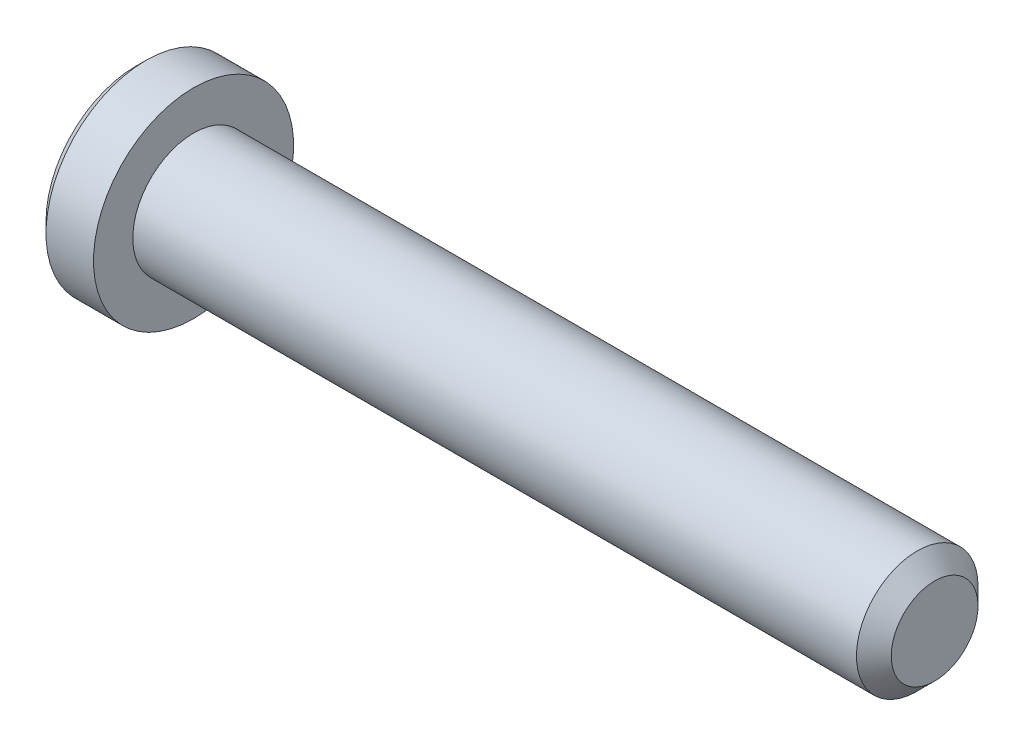
ISO-10303-21;
HEADER;
FILE_DESCRIPTION(('STEP AP214'),'2;1');
FILE_NAME('part.step','',(''),(''),'','','');
FILE_SCHEMA(('AUTOMOTIVE_DESIGN { 1 0 10303 214 1 1 1 1 }'));
ENDSEC;
DATA;
#1=APPLICATION_CONTEXT('core data for automotive mechanical design processes');
#2=APPLICATION_PROTOCOL_DEFINITION('international standard','automotive_design',2000,#1);
#3=PRODUCT_CONTEXT('',#1,'mechanical');
#4=PRODUCT('Part','Part','',(#3));
#5=PRODUCT_RELATED_PRODUCT_CATEGORY('part','',(#4));
#6=PRODUCT_DEFINITION_FORMATION('','',#4);
#7=PRODUCT_DEFINITION_CONTEXT('part definition',#1,'design');
#8=PRODUCT_DEFINITION('design','',#6,#7);
#9=PRODUCT_DEFINITION_SHAPE('','',#8);
#10=(LENGTH_UNIT() NAMED_UNIT(*) SI_UNIT(.MILLI.,.METRE.));
#11=(NAMED_UNIT(*) PLANE_ANGLE_UNIT() SI_UNIT($,.RADIAN.));
#12=(NAMED_UNIT(*) SI_UNIT($,.STERADIAN.) SOLID_ANGLE_UNIT());
#13=UNCERTAINTY_MEASURE_WITH_UNIT(LENGTH_MEASURE(1.E-05),#10,'distance_accuracy_value','');
#14=(GEOMETRIC_REPRESENTATION_CONTEXT(3) GLOBAL_UNCERTAINTY_ASSIGNED_CONTEXT((#13)) GLOBAL_UNIT_ASSIGNED_CONTEXT((#10,
#11,#12)) REPRESENTATION_CONTEXT('',''));
#15=CARTESIAN_POINT('',(0.,0.,0.));
#16=DIRECTION('',(0.,0.,1.));
#17=DIRECTION('',(1.,0.,0.));
#18=AXIS2_PLACEMENT_3D('',#15,#16,#17);
#19=CARTESIAN_POINT('',(-14.684375,3.0734,0.));
#20=DIRECTION('',(-1.,0.,0.));
#21=DIRECTION('',(0.,-1.,0.));
#22=AXIS2_PLACEMENT_3D('',#19,#20,#21);
#23=PLANE('',#22);
#24=CARTESIAN_POINT('',(-14.684375,0.,0.));
#25=DIRECTION('',(-1.,0.,0.));
#26=DIRECTION('',(0.,-1.,0.));
#27=AXIS2_PLACEMENT_3D('',#24,#25,#26);
#28=CIRCLE('',#27,1.14567944042313);
#29=CARTESIAN_POINT('',(-14.684375,-1.14567944042308,-1.38452617426399E-13));
#30=VERTEX_POINT('',#29);
#31=CARTESIAN_POINT('',(-14.684375,-0.572839720211641,0.992187499999899));
#32=VERTEX_POINT('',#31);
#33=EDGE_CURVE('E131',#30,#32,#28,.T.);
#34=ORIENTED_EDGE('',*,*,#33,.F.);
#35=CARTESIAN_POINT('',(-14.684375,-0.572839720211583,-0.9921875));
#36=VERTEX_POINT('',#35);
#37=EDGE_CURVE('E130',#36,#30,#28,.T.);
#38=ORIENTED_EDGE('',*,*,#37,.F.);
#39=CARTESIAN_POINT('',(-14.684375,0.572839720211552,-0.992187499999999));
#40=VERTEX_POINT('',#39);
#41=EDGE_CURVE('E100',#40,#36,#28,.T.);
#42=ORIENTED_EDGE('',*,*,#41,.F.);
#43=CARTESIAN_POINT('',(-14.684375,1.14567944042317,0.));
#44=VERTEX_POINT('',#43);
#45=EDGE_CURVE('E93',#44,#40,#28,.T.);
#46=ORIENTED_EDGE('',*,*,#45,.F.);
#47=CARTESIAN_POINT('',(-14.684375,0.572839720211549,0.9921875));
#48=VERTEX_POINT('',#47);
#49=EDGE_CURVE('E54',#48,#44,#28,.T.);
#50=ORIENTED_EDGE('',*,*,#49,.F.);
#51=EDGE_CURVE('E61',#32,#48,#28,.T.);
#52=ORIENTED_EDGE('',*,*,#51,.F.);
#53=EDGE_LOOP('',(#34,#38,#42,#46,#50,#52));
#54=FACE_BOUND('',#53,.T.);
#55=CARTESIAN_POINT('',(-14.684375,0.,0.));
#56=DIRECTION('',(1.,0.,0.));
#57=DIRECTION('',(0.,1.,0.));
#58=AXIS2_PLACEMENT_3D('',#55,#56,#57);
#59=CIRCLE('',#58,3.0734);
#60=CARTESIAN_POINT('',(-14.684375,3.0734,0.));
#61=VERTEX_POINT('',#60);
#62=EDGE_CURVE('E220',#61,#61,#59,.T.);
#63=ORIENTED_EDGE('',*,*,#62,.F.);
#64=EDGE_LOOP('',(#63));
#65=FACE_BOUND('',#64,.T.);
#66=ADVANCED_FACE('F34',(#54,#65),#23,.T.);
#67=CARTESIAN_POINT('',(-12.7,0.,0.));
#68=DIRECTION('',(1.,0.,0.));
#69=DIRECTION('',(0.,0.,-1.));
#70=AXIS2_PLACEMENT_3D('',#67,#68,#69);
#71=CYLINDRICAL_SURFACE('',#70,2.0828);
#72=CARTESIAN_POINT('',(12.1046875,0.,0.));
#73=DIRECTION('',(1.,0.,0.));
#74=DIRECTION('',(0.,0.,-1.));
#75=AXIS2_PLACEMENT_3D('',#72,#73,#74);
#76=CIRCLE('',#75,2.0828);
#77=CARTESIAN_POINT('',(12.1046875,0.,-2.0828));
#78=VERTEX_POINT('',#77);
#79=EDGE_CURVE('E48',#78,#78,#76,.F.);
#80=ORIENTED_EDGE('',*,*,#79,.T.);
#81=EDGE_LOOP('',(#80));
#82=FACE_BOUND('',#81,.T.);
#83=CARTESIAN_POINT('',(-12.7,0.,0.));
#84=DIRECTION('',(1.,0.,0.));
#85=DIRECTION('',(0.,1.,0.));
#86=AXIS2_PLACEMENT_3D('',#83,#84,#85);
#87=CIRCLE('',#86,2.0828);
#88=CARTESIAN_POINT('',(-12.7,2.08279999999999,0.));
#89=VERTEX_POINT('',#88);
#90=EDGE_CURVE('E213',#89,#89,#87,.F.);
#91=ORIENTED_EDGE('',*,*,#90,.F.);
#92=EDGE_LOOP('',(#91));
#93=FACE_BOUND('',#92,.T.);
#94=ADVANCED_FACE('F193',(#82,#93),#71,.T.);
#95=CARTESIAN_POINT('',(12.7,0.,0.));
#96=DIRECTION('',(1.,0.,0.));
#97=DIRECTION('',(0.,0.,-1.));
#98=AXIS2_PLACEMENT_3D('',#95,#96,#97);
#99=PLANE('',#98);
#100=CARTESIAN_POINT('',(12.7,0.,0.));
#101=DIRECTION('',(1.,0.,0.));
#102=DIRECTION('',(0.,0.,-1.));
#103=AXIS2_PLACEMENT_3D('',#100,#101,#102);
#104=CIRCLE('',#103,1.4874875);
#105=CARTESIAN_POINT('',(12.7,0.,-1.4874875));
#106=VERTEX_POINT('',#105);
#107=EDGE_CURVE('E214',#106,#106,#104,.T.);
#108=ORIENTED_EDGE('',*,*,#107,.T.);
#109=EDGE_LOOP('',(#108));
#110=FACE_BOUND('',#109,.T.);
#111=ADVANCED_FACE('F201',(#110),#99,.T.);
#112=CARTESIAN_POINT('',(12.7,0.,0.));
#113=DIRECTION('',(-1.,0.,0.));
#114=DIRECTION('',(0.,0.,1.));
#115=AXIS2_PLACEMENT_3D('',#112,#113,#114);
#116=CONICAL_SURFACE('',#115,1.4874875,0.785398163397445);
#117=ORIENTED_EDGE('',*,*,#79,.F.);
#118=EDGE_LOOP('',(#117));
#119=FACE_BOUND('',#118,.T.);
#120=ORIENTED_EDGE('',*,*,#107,.F.);
#121=EDGE_LOOP('',(#120));
#122=FACE_BOUND('',#121,.T.);
#123=ADVANCED_FACE('F36',(#119,#122),#116,.T.);
#124=CARTESIAN_POINT('',(-12.7,0.,0.));
#125=DIRECTION('',(1.,0.,0.));
#126=DIRECTION('',(0.,1.,0.));
#127=AXIS2_PLACEMENT_3D('',#124,#125,#126);
#128=CYLINDRICAL_SURFACE('',#127,3.429);
#129=CARTESIAN_POINT('',(-14.328775,0.,0.));
#130=DIRECTION('',(1.,0.,0.));
#131=DIRECTION('',(0.,1.,0.));
#132=AXIS2_PLACEMENT_3D('',#129,#130,#131);
#133=CIRCLE('',#132,3.429);
#134=CARTESIAN_POINT('',(-14.328775,3.429,0.));
#135=VERTEX_POINT('',#134);
#136=EDGE_CURVE('E215',#135,#135,#133,.T.);
#137=ORIENTED_EDGE('',*,*,#136,.T.);
#138=EDGE_LOOP('',(#137));
#139=FACE_BOUND('',#138,.T.);
#140=CARTESIAN_POINT('',(-12.7,0.,0.));
#141=DIRECTION('',(1.,0.,0.));
#142=DIRECTION('',(0.,1.,0.));
#143=AXIS2_PLACEMENT_3D('',#140,#141,#142);
#144=CIRCLE('',#143,3.429);
#145=CARTESIAN_POINT('',(-12.7,3.429,0.));
#146=VERTEX_POINT('',#145);
#147=EDGE_CURVE('E225',#146,#146,#144,.T.);
#148=ORIENTED_EDGE('',*,*,#147,.F.);
#149=EDGE_LOOP('',(#148));
#150=FACE_BOUND('',#149,.T.);
#151=ADVANCED_FACE('F196',(#139,#150),#128,.T.);
#152=CARTESIAN_POINT('',(-14.328775,0.,0.));
#153=DIRECTION('',(1.,0.,0.));
#154=DIRECTION('',(0.,1.,0.));
#155=AXIS2_PLACEMENT_3D('',#152,#153,#154);
#156=CONICAL_SURFACE('',#155,3.429,0.785398163397454);
#157=ORIENTED_EDGE('',*,*,#62,.T.);
#158=EDGE_LOOP('',(#157));
#159=FACE_BOUND('',#158,.T.);
#160=ORIENTED_EDGE('',*,*,#136,.F.);
#161=EDGE_LOOP('',(#160));
#162=FACE_BOUND('',#161,.T.);
#163=ADVANCED_FACE('F189',(#159,#162),#156,.T.);
#164=CARTESIAN_POINT('',(-12.7,3.429,0.));
#165=DIRECTION('',(1.,0.,0.));
#166=DIRECTION('',(0.,1.,0.));
#167=AXIS2_PLACEMENT_3D('',#164,#165,#166);
#168=PLANE('',#167);
#169=ORIENTED_EDGE('',*,*,#90,.T.);
#170=EDGE_LOOP('',(#169));
#171=FACE_BOUND('',#170,.T.);
#172=ORIENTED_EDGE('',*,*,#147,.T.);
#173=EDGE_LOOP('',(#172));
#174=FACE_BOUND('',#173,.T.);
#175=ADVANCED_FACE('F153',(#171,#174),#168,.T.);
#176=CARTESIAN_POINT('',(-14.684375,0.,0.));
#177=DIRECTION('',(-1.,0.,0.));
#178=DIRECTION('',(0.,-1.,0.));
#179=AXIS2_PLACEMENT_3D('',#176,#177,#178);
#180=CONICAL_SURFACE('',#179,1.14567944042313,0.78539816339745);
#181=CARTESIAN_POINT('',(-15.0518670395339,-1.14247621095534,-0.9921875));
#182=CARTESIAN_POINT('',(-15.0308666393704,-1.11465764817298,-0.9921875));
#183=CARTESIAN_POINT('',(-15.0100721478217,-1.0866840810974,-0.9921875));
#184=CARTESIAN_POINT('',(-14.9689800377932,-1.03036405380653,-0.9921875));
#185=CARTESIAN_POINT('',(-14.9486825444586,-1.00201750238009,-0.9921875));
#186=CARTESIAN_POINT('',(-14.8883735075809,-0.915909012474786,-0.9921875));
#187=CARTESIAN_POINT('',(-14.84926885225,-0.857501195957519,-0.9921875));
#188=CARTESIAN_POINT('',(-14.7725017528187,-0.735022281337401,-0.9921875));
#189=CARTESIAN_POINT('',(-14.7350490310438,-0.670818221979864,-0.9921875));
#190=CARTESIAN_POINT('',(-14.6665400204898,-0.539203244273782,-0.9921875));
#191=CARTESIAN_POINT('',(-14.6354621682745,-0.471804119013381,-0.9921875));
#192=CARTESIAN_POINT('',(-14.59744129625,-0.370637445291591,-0.9921875));
#193=CARTESIAN_POINT('',(-14.5865290323464,-0.338367677294384,-0.9921875));
#194=CARTESIAN_POINT('',(-14.567295230113,-0.273049086298082,-0.9921875));
#195=CARTESIAN_POINT('',(-14.5589738702603,-0.240000209797889,-0.992187499999999));
#196=CARTESIAN_POINT('',(-14.5454937736932,-0.173878395879195,-0.992187499999999));
#197=CARTESIAN_POINT('',(-14.5402803939747,-0.140816774783549,-0.992187499999999));
#198=CARTESIAN_POINT('',(-14.5331147124628,-0.0743291672741193,-0.992187499999999));
#199=CARTESIAN_POINT('',(-14.5311629080388,-0.0409031260707102,-0.992187499999999));
#200=CARTESIAN_POINT('',(-14.5306684859037,0.0247631140270745,-0.992187499999999));
#201=CARTESIAN_POINT('',(-14.5320050314158,0.0570024444112557,-0.992187499999999));
#202=CARTESIAN_POINT('',(-14.5377460432024,0.121194220405765,-0.992187499999999));
#203=CARTESIAN_POINT('',(-14.542149804079,0.153146730268024,-0.992187499999999));
#204=CARTESIAN_POINT('',(-14.5538595111375,0.217090524553705,-0.992187499999999));
#205=CARTESIAN_POINT('',(-14.5612153024107,0.249072542042784,-0.992187499999999));
#206=CARTESIAN_POINT('',(-14.5784380913517,0.312337779646092,-0.992187499999999));
#207=CARTESIAN_POINT('',(-14.5883048788974,0.343621057993227,-0.992187499999999));
#208=CARTESIAN_POINT('',(-14.623081111541,0.442112982998661,-0.992187499999999));
#209=CARTESIAN_POINT('',(-14.651951164078,0.507919771037783,-0.992187499999999));
#210=CARTESIAN_POINT('',(-14.7161402098149,0.636441890981787,-0.992187499999999));
#211=CARTESIAN_POINT('',(-14.7514823720824,0.699145053739879,-0.992187499999999));
#212=CARTESIAN_POINT('',(-14.8243963707045,0.818979829838917,-0.992187499999999));
#213=CARTESIAN_POINT('',(-14.8617701348683,0.876233471440161,-0.992187499999999));
#214=CARTESIAN_POINT('',(-14.919546111699,0.960585190489432,-0.992187499999999));
#215=CARTESIAN_POINT('',(-14.939008487457,0.988338378120982,-0.992187499999999));
#216=CARTESIAN_POINT('',(-14.978447981541,1.04346551309543,-0.992187499999999));
#217=CARTESIAN_POINT('',(-14.9984249576456,1.07083956207303,-0.992187499999999));
#218=CARTESIAN_POINT('',(-15.0186153053952,1.0980557448995,-0.992187499999999));
#219=B_SPLINE_CURVE_WITH_KNOTS('',3,(#181,#182,#183,#184,#185,#186,#187,#188,#189,#190,#191,
#192,#193,#194,#195,#196,#197,#198,#199,#200,#201,#202,#203,#204,#205,#206,#207,#208,#209,#210,
#211,#212,#213,#214,#215,#216,#217,#218),.UNSPECIFIED.,.F.,.F.,(4,2,2,2,2,2,2,2,2,2,2,2,2,2,2,2,
2,2,4),(0.,0.10456312739161,0.209152318718927,0.419927099055503,0.642732653996042,
0.864771652302228,0.966879847198801,1.06899507437093,1.16925752996555,1.26953527354785,
1.3661835169853,1.46280954060146,1.56114078104358,1.65946379575198,1.87441437169287,
2.09015003601506,2.29516517561961,2.3968530336129,2.49851308319265),.UNSPECIFIED.);
#220=EDGE_CURVE('E11',#36,#40,#219,.T.);
#221=ORIENTED_EDGE('',*,*,#220,.T.);
#222=ORIENTED_EDGE('',*,*,#41,.T.);
#223=EDGE_LOOP('',(#221,#222));
#224=FACE_BOUND('',#223,.T.);
#225=ADVANCED_FACE('F105',(#224),#180,.F.);
#226=CARTESIAN_POINT('',(-14.6844904875091,-1.145794910477,0.000200000000000311));
#227=CARTESIAN_POINT('',(-14.6648078114047,-1.12609913995856,-0.0339140752321567));
#228=CARTESIAN_POINT('',(-14.6462806845185,-1.10607402631377,-0.0685985894922816));
#229=CARTESIAN_POINT('',(-14.6123573296505,-1.06524035596263,-0.139324581199964));
#230=CARTESIAN_POINT('',(-14.596979987231,-1.04442791197037,-0.175372791624248));
#231=CARTESIAN_POINT('',(-14.5706381427344,-1.00246048249572,-0.248062511737404));
#232=CARTESIAN_POINT('',(-14.5596073965132,-0.981316196707006,-0.284685489013211));
#233=CARTESIAN_POINT('',(-14.542611205673,-0.938562244623581,-0.358737506246069));
#234=CARTESIAN_POINT('',(-14.536633067579,-0.916953885244204,-0.396164282559356));
#235=CARTESIAN_POINT('',(-14.5312413449144,-0.879714587318145,-0.460664638605487));
#236=CARTESIAN_POINT('',(-14.5304439963884,-0.864132099442432,-0.487654299314546));
#237=CARTESIAN_POINT('',(-14.5317831933615,-0.832997298779841,-0.541581355945683));
#238=CARTESIAN_POINT('',(-14.5339203861371,-0.817444993408161,-0.568518739024259));
#239=CARTESIAN_POINT('',(-14.5445925713061,-0.771010163908472,-0.64894622295852));
#240=CARTESIAN_POINT('',(-14.5573893807228,-0.740358726795432,-0.702036069363307));
#241=CARTESIAN_POINT('',(-14.5882724676502,-0.686562055130068,-0.795214637965818));
#242=CARTESIAN_POINT('',(-14.6047400089078,-0.663164549602735,-0.835740306309533));
#243=CARTESIAN_POINT('',(-14.6418353835569,-0.617285982385519,-0.915204315708215));
#244=CARTESIAN_POINT('',(-14.6624496806456,-0.594802217831307,-0.954147338261527));
#245=CARTESIAN_POINT('',(-14.684490487509,-0.572724250157745,-0.992387499999999));
#246=B_SPLINE_CURVE_WITH_KNOTS('',3,(#226,#227,#228,#229,#230,#231,#232,#233,#234,#235,#236,
#237,#238,#239,#240,#241,#242,#243,#244,#245),.UNSPECIFIED.,.F.,.F.,(4,2,2,2,2,2,2,2,2,4),(0.,
0.132197185210195,0.265165186853273,0.396020097605684,0.526545281028593,0.619935205043287,
0.71334573153619,0.900220051846401,1.04884529769097,1.19699303557669),.UNSPECIFIED.);
#247=EDGE_CURVE('E133',#30,#36,#246,.T.);
#248=ORIENTED_EDGE('',*,*,#247,.T.);
#249=ORIENTED_EDGE('',*,*,#37,.T.);
#250=EDGE_LOOP('',(#248,#249));
#251=FACE_BOUND('',#250,.T.);
#252=ADVANCED_FACE('F152',(#251),#180,.F.);
#253=CARTESIAN_POINT('',(-14.684490487509,-0.572724250157744,0.9923875));
#254=CARTESIAN_POINT('',(-14.6648078114047,-0.592420020676184,0.958273424767846));
#255=CARTESIAN_POINT('',(-14.6462806845185,-0.612445134320977,0.923588910507723));
#256=CARTESIAN_POINT('',(-14.6123573296505,-0.653278804672108,0.852862918800045));
#257=CARTESIAN_POINT('',(-14.596979987231,-0.674091248664371,0.816814708375763));
#258=CARTESIAN_POINT('',(-14.5706381427343,-0.716058678139018,0.744124988262612));
#259=CARTESIAN_POINT('',(-14.5596073965132,-0.737202963927729,0.707502010986808));
#260=CARTESIAN_POINT('',(-14.542611205673,-0.779956916011151,0.633449993753955));
#261=CARTESIAN_POINT('',(-14.536633067579,-0.801565275390526,0.59602321744067));
#262=CARTESIAN_POINT('',(-14.5312413449144,-0.838804573316584,0.531522861394543));
#263=CARTESIAN_POINT('',(-14.5304439963884,-0.854387061192297,0.504533200685484));
#264=CARTESIAN_POINT('',(-14.5317831933615,-0.885521861854887,0.450606144054347));
#265=CARTESIAN_POINT('',(-14.5339203861371,-0.901074167226567,0.423668760975771));
#266=CARTESIAN_POINT('',(-14.5445925713061,-0.947508996726257,0.343241277041511));
#267=CARTESIAN_POINT('',(-14.5573893807228,-0.978160433839296,0.290151430636724));
#268=CARTESIAN_POINT('',(-14.5882724676502,-1.03195710550466,0.196972862034207));
#269=CARTESIAN_POINT('',(-14.6047400089078,-1.055354611032,0.156447193690487));
#270=CARTESIAN_POINT('',(-14.6418353835569,-1.10123317824922,0.0769831842917942));
#271=CARTESIAN_POINT('',(-14.6624496806456,-1.12371694280344,0.0380401617384772));
#272=CARTESIAN_POINT('',(-14.6844904875091,-1.145794910477,-0.000199999999999885));
#273=B_SPLINE_CURVE_WITH_KNOTS('',3,(#253,#254,#255,#256,#257,#258,#259,#260,#261,#262,#263,
#264,#265,#266,#267,#268,#269,#270,#271,#272),.UNSPECIFIED.,.F.,.F.,(4,2,2,2,2,2,2,2,2,4),(0.,
0.132197185210185,0.265165186853252,0.396020097605655,0.526545281028554,0.619935205043247,
0.71334573153615,0.90022005184636,1.04884529769095,1.19699303557669),.UNSPECIFIED.);
#274=EDGE_CURVE('E140',#32,#30,#273,.T.);
#275=ORIENTED_EDGE('',*,*,#274,.T.);
#276=ORIENTED_EDGE('',*,*,#33,.T.);
#277=EDGE_LOOP('',(#275,#276));
#278=FACE_BOUND('',#277,.T.);
#279=ADVANCED_FACE('F258',(#278),#180,.F.);
#280=CARTESIAN_POINT('',(-15.0518670394084,-1.14247621078912,0.9921875));
#281=CARTESIAN_POINT('',(-15.0308666392498,-1.11465764801142,0.9921875));
#282=CARTESIAN_POINT('',(-15.0100721477059,-1.08668408094052,0.9921875));
#283=CARTESIAN_POINT('',(-14.968980037687,-1.03036405365905,0.9921875));
#284=CARTESIAN_POINT('',(-14.9486825443571,-1.00201750223733,0.9921875));
#285=CARTESIAN_POINT('',(-14.888373507494,-0.915909012346496,0.9921875));
#286=CARTESIAN_POINT('',(-14.8492688521727,-0.857501195839064,0.9921875));
#287=CARTESIAN_POINT('',(-14.7725017527612,-0.735022281240398,0.9921875));
#288=CARTESIAN_POINT('',(-14.7350490309963,-0.670818221894534,0.9921875));
#289=CARTESIAN_POINT('',(-14.6665400204611,-0.539203244212789,0.9921875));
#290=CARTESIAN_POINT('',(-14.6354621682544,-0.471804118965045,0.9921875));
#291=CARTESIAN_POINT('',(-14.5974412962363,-0.370637445252778,0.9921875));
#292=CARTESIAN_POINT('',(-14.5865290323325,-0.338367677251583,0.9921875));
#293=CARTESIAN_POINT('',(-14.5672952300994,-0.273049086247174,0.9921875));
#294=CARTESIAN_POINT('',(-14.5589738702472,-0.240000209742863,0.9921875));
#295=CARTESIAN_POINT('',(-14.5454937736822,-0.173878395816069,0.9921875));
#296=CARTESIAN_POINT('',(-14.5402803939651,-0.140816774716444,0.9921875));
#297=CARTESIAN_POINT('',(-14.5331147124571,-0.0743291671991859,0.9921875));
#298=CARTESIAN_POINT('',(-14.5311629080355,-0.040903125991928,0.9921875));
#299=CARTESIAN_POINT('',(-14.5306684859057,0.0247631141129566,0.9921875));
#300=CARTESIAN_POINT('',(-14.5320050314208,0.0570024445003988,0.9921875));
#301=CARTESIAN_POINT('',(-14.5377460432139,0.121194220501104,0.9921875));
#302=CARTESIAN_POINT('',(-14.5421498040939,0.153146730366296,0.9921875));
#303=CARTESIAN_POINT('',(-14.5538595111597,0.217090524657771,0.9921875));
#304=CARTESIAN_POINT('',(-14.5612153024367,0.2490725421497,0.9921875));
#305=CARTESIAN_POINT('',(-14.5784380913854,0.312337779758433,0.9921875));
#306=CARTESIAN_POINT('',(-14.588304878935,0.343621058108144,0.9921875));
#307=CARTESIAN_POINT('',(-14.6230811115969,0.442112983138601,0.9921875));
#308=CARTESIAN_POINT('',(-14.6519511641508,0.507919771198918,0.9921875));
#309=CARTESIAN_POINT('',(-14.7161402099234,0.636441891183682,0.9921875));
#310=CARTESIAN_POINT('',(-14.7514823722097,0.699145053961331,0.9921875));
#311=CARTESIAN_POINT('',(-14.8243963708677,0.81897983009553,0.9921875));
#312=CARTESIAN_POINT('',(-14.8617701350485,0.876233471712504,0.9921875));
#313=CARTESIAN_POINT('',(-14.9195461119046,0.960585190785034,0.9921875));
#314=CARTESIAN_POINT('',(-14.939008487671,0.988338378424223,0.9921875));
#315=CARTESIAN_POINT('',(-14.9784479817718,1.0434655134139,0.9921875));
#316=CARTESIAN_POINT('',(-14.9984249578848,1.07083956239909,0.9921875));
#317=CARTESIAN_POINT('',(-15.0186153056427,1.09805574523314,0.9921875));
#318=B_SPLINE_CURVE_WITH_KNOTS('',3,(#280,#281,#282,#283,#284,#285,#286,#287,#288,#289,#290,
#291,#292,#293,#294,#295,#296,#297,#298,#299,#300,#301,#302,#303,#304,#305,#306,#307,#308,#309,
#310,#311,#312,#313,#314,#315,#316,#317),.UNSPECIFIED.,.F.,.F.,(4,2,2,2,2,2,2,2,2,2,2,2,2,2,2,2,
2,2,4),(0.,0.104563127371708,0.209152318679117,0.419927098975131,0.642732653870183,
0.864771652131315,0.96687984703942,1.06899507422306,1.16925752982872,1.26953527342207,
1.36618351686962,1.4628095404959,1.5611407809489,1.65946379566819,1.87441437168733,
2.09015003608828,2.29516517576022,2.39685303378674,2.49851308339973),.UNSPECIFIED.);
#319=EDGE_CURVE('E160',#48,#32,#318,.F.);
#320=ORIENTED_EDGE('',*,*,#319,.T.);
#321=ORIENTED_EDGE('',*,*,#51,.T.);
#322=EDGE_LOOP('',(#320,#321));
#323=FACE_BOUND('',#322,.T.);
#324=ADVANCED_FACE('F274',(#323),#180,.F.);
#325=CARTESIAN_POINT('',(-14.684490487509,1.145794910477,-0.000200000000000207));
#326=CARTESIAN_POINT('',(-14.6648078114046,1.12609913995856,0.0339140752321549));
#327=CARTESIAN_POINT('',(-14.6462806845184,1.10607402631377,0.0685985894922777));
#328=CARTESIAN_POINT('',(-14.6123573296504,1.06524035596264,0.139324581199955));
#329=CARTESIAN_POINT('',(-14.5969799872309,1.04442791197038,0.175372791624237));
#330=CARTESIAN_POINT('',(-14.5706381427343,1.00246048249573,0.248062511737387));
#331=CARTESIAN_POINT('',(-14.5596073965131,0.981316196707018,0.284685489013192));
#332=CARTESIAN_POINT('',(-14.5426112056729,0.938562244623596,0.358737506246044));
#333=CARTESIAN_POINT('',(-14.5366330675789,0.916953885244221,0.396164282559329));
#334=CARTESIAN_POINT('',(-14.5312413449143,0.879714587318163,0.460664638605455));
#335=CARTESIAN_POINT('',(-14.5304439963883,0.864132099442452,0.487654299314513));
#336=CARTESIAN_POINT('',(-14.5317831933614,0.832997298779864,0.541581355945646));
#337=CARTESIAN_POINT('',(-14.533920386137,0.817444993408184,0.56851873902422));
#338=CARTESIAN_POINT('',(-14.544592571306,0.771010163908498,0.648946222958475));
#339=CARTESIAN_POINT('',(-14.5573893807227,0.74035872679546,0.702036069363259));
#340=CARTESIAN_POINT('',(-14.5882724676501,0.686562055130093,0.795214637965777));
#341=CARTESIAN_POINT('',(-14.6047400089077,0.663164549602755,0.8357403063095));
#342=CARTESIAN_POINT('',(-14.6418353835568,0.617285982385529,0.915204315708199));
#343=CARTESIAN_POINT('',(-14.6624496806455,0.594802217831312,0.95414733826152));
#344=CARTESIAN_POINT('',(-14.684490487509,0.572724250157745,0.9923875));
#345=B_SPLINE_CURVE_WITH_KNOTS('',3,(#325,#326,#327,#328,#329,#330,#331,#332,#333,#334,#335,
#336,#337,#338,#339,#340,#341,#342,#343,#344),.UNSPECIFIED.,.F.,.F.,(4,2,2,2,2,2,2,2,2,4),(0.,
0.132197185210187,0.265165186853254,0.396020097605656,0.526545281028556,0.619935205043243,
0.71334573153614,0.900220051846339,1.04884529769094,1.1969930355767),.UNSPECIFIED.);
#346=EDGE_CURVE('E120',#44,#48,#345,.T.);
#347=ORIENTED_EDGE('',*,*,#346,.T.);
#348=ORIENTED_EDGE('',*,*,#49,.T.);
#349=EDGE_LOOP('',(#347,#348));
#350=FACE_BOUND('',#349,.T.);
#351=ADVANCED_FACE('F250',(#350),#180,.F.);
#352=CARTESIAN_POINT('',(-14.684490487509,0.572724250157745,-0.992387499999999));
#353=CARTESIAN_POINT('',(-14.6648078114047,0.592420020676186,-0.958273424767842));
#354=CARTESIAN_POINT('',(-14.6462806845184,0.612445134320981,-0.923588910507717));
#355=CARTESIAN_POINT('',(-14.6123573296504,0.653278804672114,-0.852862918800036));
#356=CARTESIAN_POINT('',(-14.596979987231,0.674091248664379,-0.816814708375752));
#357=CARTESIAN_POINT('',(-14.5706381427343,0.716058678139028,-0.744124988262596));
#358=CARTESIAN_POINT('',(-14.5596073965131,0.73720296392774,-0.707502010986789));
#359=CARTESIAN_POINT('',(-14.5426112056729,0.779956916011166,-0.633449993753932));
#360=CARTESIAN_POINT('',(-14.5366330675789,0.801565275390542,-0.596023217440644));
#361=CARTESIAN_POINT('',(-14.5312413449143,0.838804573316601,-0.531522861394515));
#362=CARTESIAN_POINT('',(-14.5304439963883,0.854387061192312,-0.504533200685457));
#363=CARTESIAN_POINT('',(-14.5317831933614,0.885521861854901,-0.450606144054324));
#364=CARTESIAN_POINT('',(-14.533920386137,0.90107416722658,-0.42366876097575));
#365=CARTESIAN_POINT('',(-14.544592571306,0.947508996726267,-0.343241277041494));
#366=CARTESIAN_POINT('',(-14.5573893807227,0.978160433839305,-0.29015143063671));
#367=CARTESIAN_POINT('',(-14.5882724676501,1.03195710550467,-0.196972862034198));
#368=CARTESIAN_POINT('',(-14.6047400089077,1.055354611032,-0.156447193690479));
#369=CARTESIAN_POINT('',(-14.6418353835568,1.10123317824922,-0.0769831842917902));
#370=CARTESIAN_POINT('',(-14.6624496806455,1.12371694280344,-0.0380401617384752));
#371=CARTESIAN_POINT('',(-14.684490487509,1.145794910477,0.000200000000000118));
#372=B_SPLINE_CURVE_WITH_KNOTS('',3,(#352,#353,#354,#355,#356,#357,#358,#359,#360,#361,#362,
#363,#364,#365,#366,#367,#368,#369,#370,#371),.UNSPECIFIED.,.F.,.F.,(4,2,2,2,2,2,2,2,2,4),(0.,
0.132197185210196,0.265165186853273,0.396020097605685,0.526545281028594,0.619935205043282,
0.713345731536179,0.900220051846379,1.04884529769096,1.1969930355767),.UNSPECIFIED.);
#373=EDGE_CURVE('E96',#40,#44,#372,.T.);
#374=ORIENTED_EDGE('',*,*,#373,.T.);
#375=ORIENTED_EDGE('',*,*,#45,.T.);
#376=EDGE_LOOP('',(#374,#375));
#377=FACE_BOUND('',#376,.T.);
#378=ADVANCED_FACE('F94',(#377),#180,.F.);
#379=CARTESIAN_POINT('',(-13.160375,1.14567944042316,0.));
#380=DIRECTION('',(1.,0.,0.));
#381=DIRECTION('',(0.,0.,-1.));
#382=AXIS2_PLACEMENT_3D('',#379,#380,#381);
#383=PLANE('',#382);
#384=DIRECTION('',(0.,0.5,0.866025403784439));
#385=VECTOR('',#384,1.);
#386=CARTESIAN_POINT('',(-13.160375,0.572839720211583,-0.992187499999999));
#387=LINE('',#386,#385);
#388=CARTESIAN_POINT('',(-13.160375,0.572839720211583,-0.992187499999999));
#389=VERTEX_POINT('',#388);
#390=CARTESIAN_POINT('',(-13.160375,1.14567944042316,0.));
#391=VERTEX_POINT('',#390);
#392=EDGE_CURVE('E119',#389,#391,#387,.T.);
#393=ORIENTED_EDGE('',*,*,#392,.F.);
#394=DIRECTION('',(0.,1.,0.));
#395=VECTOR('',#394,1.);
#396=CARTESIAN_POINT('',(-13.160375,-0.572839720211583,-0.9921875));
#397=LINE('',#396,#395);
#398=CARTESIAN_POINT('',(-13.160375,-0.572839720211583,-0.9921875));
#399=VERTEX_POINT('',#398);
#400=EDGE_CURVE('E124',#399,#389,#397,.T.);
#401=ORIENTED_EDGE('',*,*,#400,.F.);
#402=DIRECTION('',(0.,0.5,-0.866025403784439));
#403=VECTOR('',#402,1.);
#404=CARTESIAN_POINT('',(-13.160375,-1.14567944042316,0.));
#405=LINE('',#404,#403);
#406=CARTESIAN_POINT('',(-13.160375,-1.14567944042316,0.));
#407=VERTEX_POINT('',#406);
#408=EDGE_CURVE('E240',#407,#399,#405,.T.);
#409=ORIENTED_EDGE('',*,*,#408,.F.);
#410=DIRECTION('',(0.,-0.5,-0.866025403784439));
#411=VECTOR('',#410,1.);
#412=CARTESIAN_POINT('',(-13.160375,-0.572839720211582,0.9921875));
#413=LINE('',#412,#411);
#414=CARTESIAN_POINT('',(-13.160375,-0.572839720211582,0.9921875));
#415=VERTEX_POINT('',#414);
#416=EDGE_CURVE('E242',#415,#407,#413,.T.);
#417=ORIENTED_EDGE('',*,*,#416,.F.);
#418=DIRECTION('',(0.,-1.,0.));
#419=VECTOR('',#418,1.);
#420=CARTESIAN_POINT('',(-13.160375,0.572839720211583,0.9921875));
#421=LINE('',#420,#419);
#422=CARTESIAN_POINT('',(-13.160375,0.572839720211583,0.9921875));
#423=VERTEX_POINT('',#422);
#424=EDGE_CURVE('E244',#423,#415,#421,.T.);
#425=ORIENTED_EDGE('',*,*,#424,.F.);
#426=DIRECTION('',(0.,-0.499999999999999,0.866025403784439));
#427=VECTOR('',#426,1.);
#428=CARTESIAN_POINT('',(-13.160375,1.14567944042316,0.));
#429=LINE('',#428,#427);
#430=EDGE_CURVE('E246',#391,#423,#429,.T.);
#431=ORIENTED_EDGE('',*,*,#430,.F.);
#432=EDGE_LOOP('',(#393,#401,#409,#417,#425,#431));
#433=FACE_BOUND('',#432,.T.);
#434=ADVANCED_FACE('F154',(#433),#383,.F.);
#435=CARTESIAN_POINT('',(-13.160375,-0.572839720211583,-0.9921875));
#436=DIRECTION('',(0.,0.,1.));
#437=DIRECTION('',(0.,-1.,0.));
#438=AXIS2_PLACEMENT_3D('',#435,#436,#437);
#439=PLANE('',#438);
#440=ORIENTED_EDGE('',*,*,#220,.F.);
#441=DIRECTION('',(-1.,0.,0.));
#442=VECTOR('',#441,1.);
#443=CARTESIAN_POINT('',(-13.160375,-0.572839720211583,-0.9921875));
#444=LINE('',#443,#442);
#445=EDGE_CURVE('E125',#399,#36,#444,.T.);
#446=ORIENTED_EDGE('',*,*,#445,.F.);
#447=ORIENTED_EDGE('',*,*,#400,.T.);
#448=DIRECTION('',(-1.,0.,0.));
#449=VECTOR('',#448,1.);
#450=CARTESIAN_POINT('',(-13.160375,0.572839720211583,-0.992187499999999));
#451=LINE('',#450,#449);
#452=EDGE_CURVE('E115',#389,#40,#451,.T.);
#453=ORIENTED_EDGE('',*,*,#452,.T.);
#454=EDGE_LOOP('',(#440,#446,#447,#453));
#455=FACE_BOUND('',#454,.T.);
#456=ADVANCED_FACE('F122',(#455),#439,.T.);
#457=CARTESIAN_POINT('',(-13.160375,-1.14567944042316,0.));
#458=DIRECTION('',(0.,0.866025403784439,0.5));
#459=DIRECTION('',(0.,-0.5,0.866025403784439));
#460=AXIS2_PLACEMENT_3D('',#457,#458,#459);
#461=PLANE('',#460);
#462=ORIENTED_EDGE('',*,*,#247,.F.);
#463=DIRECTION('',(-1.,0.,0.));
#464=VECTOR('',#463,1.);
#465=CARTESIAN_POINT('',(-13.160375,-1.14567944042316,0.));
#466=LINE('',#465,#464);
#467=EDGE_CURVE('E235',#407,#30,#466,.T.);
#468=ORIENTED_EDGE('',*,*,#467,.F.);
#469=ORIENTED_EDGE('',*,*,#408,.T.);
#470=ORIENTED_EDGE('',*,*,#445,.T.);
#471=EDGE_LOOP('',(#462,#468,#469,#470));
#472=FACE_BOUND('',#471,.T.);
#473=ADVANCED_FACE('F147',(#472),#461,.T.);
#474=CARTESIAN_POINT('',(-13.160375,-0.572839720211582,0.9921875));
#475=DIRECTION('',(0.,0.866025403784439,-0.5));
#476=DIRECTION('',(0.,0.5,0.866025403784439));
#477=AXIS2_PLACEMENT_3D('',#474,#475,#476);
#478=PLANE('',#477);
#479=ORIENTED_EDGE('',*,*,#274,.F.);
#480=DIRECTION('',(-1.,0.,0.));
#481=VECTOR('',#480,1.);
#482=CARTESIAN_POINT('',(-13.160375,-0.572839720211582,0.9921875));
#483=LINE('',#482,#481);
#484=EDGE_CURVE('E232',#415,#32,#483,.T.);
#485=ORIENTED_EDGE('',*,*,#484,.F.);
#486=ORIENTED_EDGE('',*,*,#416,.T.);
#487=ORIENTED_EDGE('',*,*,#467,.T.);
#488=EDGE_LOOP('',(#479,#485,#486,#487));
#489=FACE_BOUND('',#488,.T.);
#490=ADVANCED_FACE('F264',(#489),#478,.T.);
#491=CARTESIAN_POINT('',(-13.160375,0.572839720211583,0.9921875));
#492=DIRECTION('',(0.,0.,-1.));
#493=DIRECTION('',(-1.,0.,0.));
#494=AXIS2_PLACEMENT_3D('',#491,#492,#493);
#495=PLANE('',#494);
#496=ORIENTED_EDGE('',*,*,#319,.F.);
#497=DIRECTION('',(-1.,0.,0.));
#498=VECTOR('',#497,1.);
#499=CARTESIAN_POINT('',(-13.160375,0.572839720211583,0.9921875));
#500=LINE('',#499,#498);
#501=EDGE_CURVE('E229',#423,#48,#500,.T.);
#502=ORIENTED_EDGE('',*,*,#501,.F.);
#503=ORIENTED_EDGE('',*,*,#424,.T.);
#504=ORIENTED_EDGE('',*,*,#484,.T.);
#505=EDGE_LOOP('',(#496,#502,#503,#504));
#506=FACE_BOUND('',#505,.T.);
#507=ADVANCED_FACE('F181',(#506),#495,.T.);
#508=CARTESIAN_POINT('',(-13.160375,1.14567944042316,0.));
#509=DIRECTION('',(0.,-0.866025403784439,-0.499999999999999));
#510=DIRECTION('',(0.,0.499999999999999,-0.866025403784439));
#511=AXIS2_PLACEMENT_3D('',#508,#509,#510);
#512=PLANE('',#511);
#513=ORIENTED_EDGE('',*,*,#346,.F.);
#514=DIRECTION('',(-1.,0.,0.));
#515=VECTOR('',#514,1.);
#516=CARTESIAN_POINT('',(-13.160375,1.14567944042316,0.));
#517=LINE('',#516,#515);
#518=EDGE_CURVE('E118',#391,#44,#517,.T.);
#519=ORIENTED_EDGE('',*,*,#518,.F.);
#520=ORIENTED_EDGE('',*,*,#430,.T.);
#521=ORIENTED_EDGE('',*,*,#501,.T.);
#522=EDGE_LOOP('',(#513,#519,#520,#521));
#523=FACE_BOUND('',#522,.T.);
#524=ADVANCED_FACE('F178',(#523),#512,.T.);
#525=CARTESIAN_POINT('',(-13.160375,0.572839720211583,-0.992187499999999));
#526=DIRECTION('',(0.,-0.866025403784439,0.5));
#527=DIRECTION('',(0.,-0.5,-0.866025403784439));
#528=AXIS2_PLACEMENT_3D('',#525,#526,#527);
#529=PLANE('',#528);
#530=ORIENTED_EDGE('',*,*,#373,.F.);
#531=ORIENTED_EDGE('',*,*,#452,.F.);
#532=ORIENTED_EDGE('',*,*,#392,.T.);
#533=ORIENTED_EDGE('',*,*,#518,.T.);
#534=EDGE_LOOP('',(#530,#531,#532,#533));
#535=FACE_BOUND('',#534,.T.);
#536=ADVANCED_FACE('F113',(#535),#529,.T.);
#537=CLOSED_SHELL('',(#66,#94,#111,#123,#151,#163,#175,#225,#252,#279,#324,#351,#378,#434,#456,
#473,#490,#507,#524,#536));
#538=MANIFOLD_SOLID_BREP('B2',#537);
#539=ADVANCED_BREP_SHAPE_REPRESENTATION('',(#18,#538),#14);
#540=SHAPE_DEFINITION_REPRESENTATION(#9,#539);
ENDSEC;
END-ISO-10303-21;
